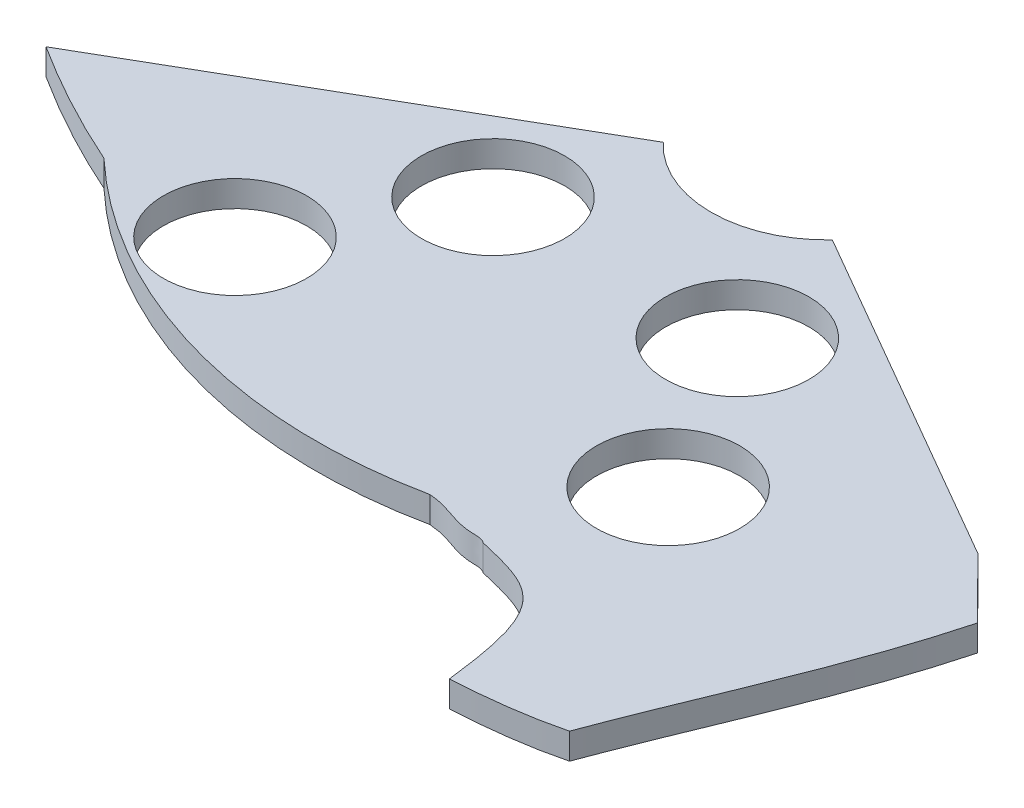
ISO-10303-21;
HEADER;
FILE_DESCRIPTION(('STEP AP214'),'2;1');
FILE_NAME('part.step','',(''),(''),'','','');
FILE_SCHEMA(('AUTOMOTIVE_DESIGN { 1 0 10303 214 1 1 1 1 }'));
ENDSEC;
DATA;
#1=APPLICATION_CONTEXT('core data for automotive mechanical design processes');
#2=APPLICATION_PROTOCOL_DEFINITION('international standard','automotive_design',2000,#1);
#3=PRODUCT_CONTEXT('',#1,'mechanical');
#4=PRODUCT('Part','Part','',(#3));
#5=PRODUCT_RELATED_PRODUCT_CATEGORY('part','',(#4));
#6=PRODUCT_DEFINITION_FORMATION('','',#4);
#7=PRODUCT_DEFINITION_CONTEXT('part definition',#1,'design');
#8=PRODUCT_DEFINITION('design','',#6,#7);
#9=PRODUCT_DEFINITION_SHAPE('','',#8);
#10=(LENGTH_UNIT() NAMED_UNIT(*) SI_UNIT(.MILLI.,.METRE.));
#11=(NAMED_UNIT(*) PLANE_ANGLE_UNIT() SI_UNIT($,.RADIAN.));
#12=(NAMED_UNIT(*) SI_UNIT($,.STERADIAN.) SOLID_ANGLE_UNIT());
#13=UNCERTAINTY_MEASURE_WITH_UNIT(LENGTH_MEASURE(1.E-05),#10,'distance_accuracy_value','');
#14=(GEOMETRIC_REPRESENTATION_CONTEXT(3) GLOBAL_UNCERTAINTY_ASSIGNED_CONTEXT((#13)) GLOBAL_UNIT_ASSIGNED_CONTEXT((#10,
#11,#12)) REPRESENTATION_CONTEXT('',''));
#15=CARTESIAN_POINT('',(0.,0.,0.));
#16=DIRECTION('',(0.,0.,1.));
#17=DIRECTION('',(1.,0.,0.));
#18=AXIS2_PLACEMENT_3D('',#15,#16,#17);
#19=CARTESIAN_POINT('',(50.4545002333364,-47.7359999999999,99.0797589701846));
#20=DIRECTION('',(0.,1.,0.));
#21=DIRECTION('',(0.,0.,1.));
#22=AXIS2_PLACEMENT_3D('',#19,#20,#21);
#23=PLANE('',#22);
#24=CARTESIAN_POINT('',(18.75,-47.7359999999999,32.476));
#25=DIRECTION('',(0.,-1.,0.));
#26=DIRECTION('',(0.,0.,-1.));
#27=AXIS2_PLACEMENT_3D('',#24,#25,#26);
#28=CIRCLE('',#27,10.999845998306);
#29=CARTESIAN_POINT('',(18.75,-47.7359999999999,21.476154001694));
#30=VERTEX_POINT('',#29);
#31=EDGE_CURVE('E476',#30,#30,#28,.T.);
#32=ORIENTED_EDGE('',*,*,#31,.F.);
#33=EDGE_LOOP('',(#32));
#34=FACE_BOUND('',#33,.T.);
#35=CARTESIAN_POINT('',(-33.25,-47.7359999999999,57.591));
#36=DIRECTION('',(0.,-1.,0.));
#37=DIRECTION('',(0.,0.,-1.));
#38=AXIS2_PLACEMENT_3D('',#35,#36,#37);
#39=CIRCLE('',#38,10.999845998306);
#40=CARTESIAN_POINT('',(-33.25,-47.7359999999999,46.591154001694));
#41=VERTEX_POINT('',#40);
#42=EDGE_CURVE('E438',#41,#41,#39,.T.);
#43=ORIENTED_EDGE('',*,*,#42,.F.);
#44=EDGE_LOOP('',(#43));
#45=FACE_BOUND('',#44,.T.);
#46=CARTESIAN_POINT('',(58.1236550059077,-47.7359999999999,97.60623936942));
#47=CARTESIAN_POINT('',(53.3063543837933,-47.7359999999999,98.8469564616505));
#48=CARTESIAN_POINT('',(47.877739729695,-47.7359999999999,99.532554783994));
#49=CARTESIAN_POINT('',(41.9600645203191,-47.7359999999999,99.8932986551236));
#50=B_SPLINE_CURVE_WITH_KNOTS('',3,(#46,#47,#48,#49),.UNSPECIFIED.,.F.,.F.,(4,4),(0.,1.),.UNSPECIFIED.);
#51=CARTESIAN_POINT('',(58.1236333761888,-47.7359999999999,97.6062449402475));
#52=VERTEX_POINT('',#51);
#53=CARTESIAN_POINT('',(41.9601443038788,-47.7359999999999,99.8932937914643));
#54=VERTEX_POINT('',#53);
#55=EDGE_CURVE('E426',#52,#54,#50,.T.);
#56=ORIENTED_EDGE('',*,*,#55,.T.);
#57=DIRECTION('',(-0.803323312901338,0.,-0.595543159602408));
#58=VECTOR('',#57,1.);
#59=CARTESIAN_POINT('',(41.9601443038788,-47.7359999999999,99.8932937914643));
#60=LINE('',#59,#58);
#61=CARTESIAN_POINT('',(41.9598808443938,-47.7359999999999,99.8930984759647));
#62=VERTEX_POINT('',#61);
#63=EDGE_CURVE('E110',#54,#62,#60,.T.);
#64=ORIENTED_EDGE('',*,*,#63,.T.);
#65=CARTESIAN_POINT('',(41.9599064263799,-47.7359999999999,99.8933082925096));
#66=CARTESIAN_POINT('',(41.9136796215511,-47.7359999999999,99.5141685179539));
#67=CARTESIAN_POINT('',(41.8240273725822,-47.7359999999999,98.7788649730003));
#68=CARTESIAN_POINT('',(41.6223415280567,-47.7359999999999,97.2357965297223));
#69=CARTESIAN_POINT('',(41.3520309105574,-47.7359999999999,95.3658266863958));
#70=CARTESIAN_POINT('',(40.9609838155468,-47.7359999999999,93.1025289505967));
#71=CARTESIAN_POINT('',(40.4898500439049,-47.7359999999999,90.9019339336516));
#72=CARTESIAN_POINT('',(39.8681523154453,-47.7359999999999,88.6856751252058));
#73=CARTESIAN_POINT('',(39.0324702122265,-47.7359999999999,86.5353918258231));
#74=CARTESIAN_POINT('',(38.0644771653085,-47.7359999999999,84.8623502560792));
#75=CARTESIAN_POINT('',(37.0826905965218,-47.7359999999999,83.6785386296944));
#76=CARTESIAN_POINT('',(36.2505037011043,-47.7359999999999,82.8912386045687));
#77=CARTESIAN_POINT('',(35.3237483813195,-47.7359999999999,82.206074176256));
#78=CARTESIAN_POINT('',(34.3369821246836,-47.7359999999999,81.6319970631862));
#79=CARTESIAN_POINT('',(33.280362004483,-47.7359999999999,81.1404465081158));
#80=CARTESIAN_POINT('',(31.8399712928665,-47.7359999999999,80.5917268042892));
#81=CARTESIAN_POINT('',(29.9756205744588,-47.7359999999999,80.0455244691998));
#82=CARTESIAN_POINT('',(27.7335886508905,-47.7359999999999,79.494400516862));
#83=CARTESIAN_POINT('',(25.9474640868269,-47.7359999999999,79.0719981797936));
#84=CARTESIAN_POINT('',(24.9143470138064,-47.7359999999999,78.8103290185063));
#85=CARTESIAN_POINT('',(24.627450886595,-47.7359999999999,78.7376636149964));
#86=B_SPLINE_CURVE_WITH_KNOTS('',3,(#65,#66,#67,#68,#69,#70,#71,#72,#73,#74,#75,#76,#77,#78,#79,
#80,#81,#82,#83,#84,#85),.UNSPECIFIED.,.F.,.F.,(4,1,1,1,1,1,1,1,1,1,1,1,1,1,1,1,1,1,4),(0.,
0.0372590655782159,0.0722602186315704,0.151806843381986,0.221553852219371,0.296283061667087,
0.37125515693742,0.445866892224854,0.520855543534189,0.558526767610036,0.595560823699377,
0.632325876297881,0.670709326434642,0.706723642247913,0.745895328604427,0.820965097437735,
0.896036966948439,0.97112951442333,1.),.UNSPECIFIED.);
#87=CARTESIAN_POINT('',(26.4526000611832,-47.7359999999999,79.1900571500032));
#88=VERTEX_POINT('',#87);
#89=EDGE_CURVE('E277',#62,#88,#86,.T.);
#90=ORIENTED_EDGE('',*,*,#89,.T.);
#91=CARTESIAN_POINT('',(15.9463461317283,-47.7359999999999,76.8631345149614));
#92=CARTESIAN_POINT('',(16.0349186676208,-47.7359999999999,76.8699952488525));
#93=CARTESIAN_POINT('',(16.2014291596154,-47.7359999999999,76.8828929734591));
#94=CARTESIAN_POINT('',(16.5552058601293,-47.7359999999999,76.9178891039632));
#95=CARTESIAN_POINT('',(17.1925741789564,-47.7359999999999,76.9996629331847));
#96=CARTESIAN_POINT('',(18.1171268339879,-47.7359999999999,77.180966088835));
#97=CARTESIAN_POINT('',(19.0228778908417,-47.7359999999999,77.4400890473989));
#98=CARTESIAN_POINT('',(19.7396059124913,-47.7359999999999,77.6763448393383));
#99=CARTESIAN_POINT('',(20.4548788063946,-47.7359999999999,77.9221711319904));
#100=CARTESIAN_POINT('',(21.3506455584367,-47.7359999999999,78.2260677505473));
#101=CARTESIAN_POINT('',(22.4467975100287,-47.7359999999999,78.5192203072604));
#102=CARTESIAN_POINT('',(23.3802844774172,-47.7359999999999,78.6689586021613));
#103=CARTESIAN_POINT('',(24.0218923582953,-47.7359999999999,78.7190307812592));
#104=CARTESIAN_POINT('',(24.9869181517329,-47.7359999999999,78.7594210102172));
#105=CARTESIAN_POINT('',(25.7662837705111,-47.7359999999999,78.6946604402071));
#106=CARTESIAN_POINT('',(26.4526000611883,-47.7359999999999,79.1900571500034));
#107=B_SPLINE_CURVE_WITH_KNOTS('',3,(#91,#92,#93,#94,#95,#96,#97,#98,#99,#100,#101,#102,#103,
#104,#105,#106),.UNSPECIFIED.,.F.,.F.,(4,1,1,1,1,1,1,1,1,1,1,1,1,4),(-0.511072759064358,
-0.481190059937095,-0.454895266982101,-0.391495215083181,-0.265087959623093,-0.138428007429866,
-0.074862953904877,-0.0112348579292886,0.115994009552745,0.243269880945794,0.369974881399668,
0.433338957204713,0.459665995638456,0.694844596012279),.UNSPECIFIED.);
#108=CARTESIAN_POINT('',(15.9463461317283,-47.7359999999999,76.8631345149614));
#109=VERTEX_POINT('',#108);
#110=EDGE_CURVE('E260',#88,#109,#107,.F.);
#111=ORIENTED_EDGE('',*,*,#110,.T.);
#112=CARTESIAN_POINT('',(-53.7925190008307,-47.7359999999999,57.1715620321963));
#113=CARTESIAN_POINT('',(-51.5067879276189,-47.7359999999999,59.3225126550984));
#114=CARTESIAN_POINT('',(-49.0927337036031,-47.7359999999999,61.335512341454));
#115=CARTESIAN_POINT('',(-44.0392056625974,-47.7359999999999,65.0587222228256));
#116=CARTESIAN_POINT('',(-41.4004114246385,-47.7359999999999,66.7691294634532));
#117=CARTESIAN_POINT('',(-33.2074671785609,-47.7359999999999,71.4072570539393));
#118=CARTESIAN_POINT('',(-27.3728712629462,-47.7359999999999,73.8409296722342));
#119=CARTESIAN_POINT('',(-18.3117111209384,-47.7359999999999,76.3985288720214));
#120=CARTESIAN_POINT('',(-15.2395918122596,-47.7359999999999,77.0700449589798));
#121=CARTESIAN_POINT('',(-9.03835232532188,-47.7359999999999,78.0407980399762));
#122=CARTESIAN_POINT('',(-5.90888980689045,-47.7359999999999,78.3395161847587));
#123=CARTESIAN_POINT('',(0.364731385860129,-47.7359999999999,78.5611583825753));
#124=CARTESIAN_POINT('',(3.50826904111767,-47.7359999999999,78.4842083991054));
#125=CARTESIAN_POINT('',(9.76128948684666,-47.7359999999999,77.9539257140327));
#126=CARTESIAN_POINT('',(12.8733144267638,-47.7359999999999,77.500414419352));
#127=CARTESIAN_POINT('',(15.94634613171,-47.7359999999999,76.8631345148816));
#128=B_SPLINE_CURVE_WITH_KNOTS('',3,(#112,#113,#114,#115,#116,#117,#118,#119,#120,#121,#122,
#123,#124,#125,#126,#127),.UNSPECIFIED.,.F.,.F.,(4,2,2,2,2,2,2,4),(1.8714680629639E-06,
0.125001871468063,0.250001871468063,0.500001871468063,0.625001871468063,0.750001871468063,
0.875001871468063,1.),.UNSPECIFIED.);
#129=CARTESIAN_POINT('',(-53.7925190008307,-47.7359999999999,57.1715620321963));
#130=VERTEX_POINT('',#129);
#131=EDGE_CURVE('E461',#109,#130,#128,.F.);
#132=ORIENTED_EDGE('',*,*,#131,.T.);
#133=CARTESIAN_POINT('',(-73.0589578356867,-47.7359999999999,46.7994745524431));
#134=CARTESIAN_POINT('',(-72.605285648142,-47.7359999999999,47.0869715717123));
#135=CARTESIAN_POINT('',(-71.6919777443133,-47.7359999999999,47.6657447635335));
#136=CARTESIAN_POINT('',(-70.1024919814528,-47.7359999999999,48.6430162496284));
#137=CARTESIAN_POINT('',(-68.2739140317229,-47.7359999999999,49.735875425829));
#138=CARTESIAN_POINT('',(-66.2266480228188,-47.7359999999999,50.9145990127126));
#139=CARTESIAN_POINT('',(-64.1364579733773,-47.7359999999999,52.0742657152988));
#140=CARTESIAN_POINT('',(-62.0609857516435,-47.7359999999999,53.1820058272664));
#141=CARTESIAN_POINT('',(-59.9245981104603,-47.7359999999999,54.2778266083573));
#142=CARTESIAN_POINT('',(-58.2167192811015,-47.7359999999999,55.1183422239238));
#143=CARTESIAN_POINT('',(-56.8747572673933,-47.7359999999999,55.7592839251759));
#144=CARTESIAN_POINT('',(-55.9306994311954,-47.7359999999999,56.2019198641064));
#145=CARTESIAN_POINT('',(-54.8942332656221,-47.7359999999999,56.6789234612153));
#146=CARTESIAN_POINT('',(-54.169845740253,-47.7359999999999,57.0028367932866));
#147=CARTESIAN_POINT('',(-53.7925226257047,-47.7359999999999,57.171558621066));
#148=B_SPLINE_CURVE_WITH_KNOTS('',3,(#133,#134,#135,#136,#137,#138,#139,#140,#141,#142,#143,
#144,#145,#146,#147),.UNSPECIFIED.,.F.,.F.,(4,1,1,1,1,1,1,1,1,1,1,1,4),(0.,0.0735699952039779,
0.148107069265318,0.255578974128456,0.365359669575418,0.471683017424209,0.58299103191735,
0.68759811495675,0.80056029840056,0.843715385452293,0.891306996020602,0.943383366837763,1.),.UNSPECIFIED.);
#149=CARTESIAN_POINT('',(-73.0589578356867,-47.7359999999999,46.7994745524431));
#150=VERTEX_POINT('',#149);
#151=EDGE_CURVE('E326',#130,#150,#148,.F.);
#152=ORIENTED_EDGE('',*,*,#151,.T.);
#153=CARTESIAN_POINT('',(-73.0589561353499,-47.7359999999999,46.7994735707082));
#154=DIRECTION('',(0.866024430196259,0.,-0.500001686300401));
#155=VECTOR('',#154,1.);
#156=LINE('',#153,#155);
#157=CARTESIAN_POINT('',(-69.4473396581905,-47.7359999999999,44.7142964488102));
#158=VERTEX_POINT('',#157);
#159=EDGE_CURVE('E322',#150,#158,#156,.T.);
#160=ORIENTED_EDGE('',*,*,#159,.T.);
#161=DIRECTION('',(0.866025121866504,0.,-0.500000488295869));
#162=VECTOR('',#161,1.);
#163=CARTESIAN_POINT('',(-69.4473396581905,-47.7359999999999,44.7142964488102));
#164=LINE('',#163,#162);
#165=CARTESIAN_POINT('',(-12.9766531358799,-47.7359999999999,12.1108879302399));
#166=VERTEX_POINT('',#165);
#167=EDGE_CURVE('E319',#158,#166,#164,.T.);
#168=ORIENTED_EDGE('',*,*,#167,.T.);
#169=CARTESIAN_POINT('',(0.,-47.7359999999999,0.));
#170=DIRECTION('',(0.,1.,0.));
#171=DIRECTION('',(0.,0.,-1.));
#172=AXIS2_PLACEMENT_3D('',#169,#170,#171);
#173=CIRCLE('',#172,17.7501305084715);
#174=CARTESIAN_POINT('',(12.9766531358511,-47.7359999999999,12.1108879302707));
#175=VERTEX_POINT('',#174);
#176=EDGE_CURVE('E315',#166,#175,#173,.T.);
#177=ORIENTED_EDGE('',*,*,#176,.T.);
#178=DIRECTION('',(0.866025113442762,0.,0.500000502886198));
#179=VECTOR('',#178,1.);
#180=CARTESIAN_POINT('',(12.9766531358511,-47.7359999999999,12.1108879302707));
#181=LINE('',#180,#179);
#182=CARTESIAN_POINT('',(65.8946490574716,-47.7359999999999,42.6631480920527));
#183=VERTEX_POINT('',#182);
#184=EDGE_CURVE('E144',#175,#183,#181,.T.);
#185=ORIENTED_EDGE('',*,*,#184,.T.);
#186=DIRECTION('',(0.702943256867949,0.,0.711245933291629));
#187=VECTOR('',#186,1.);
#188=CARTESIAN_POINT('',(65.8946490574716,-47.7359999999999,42.6631480920527));
#189=LINE('',#188,#187);
#190=CARTESIAN_POINT('',(75.0480430404488,-47.7359999999999,51.9246555929797));
#191=VERTEX_POINT('',#190);
#192=EDGE_CURVE('E138',#183,#191,#189,.T.);
#193=ORIENTED_EDGE('',*,*,#192,.T.);
#194=CARTESIAN_POINT('',(75.0480430404488,-47.7359999999999,51.9246555929797));
#195=CARTESIAN_POINT('',(74.9426312519638,-47.7359999999999,52.3150510355307));
#196=CARTESIAN_POINT('',(74.7316675790062,-47.7359999999999,53.096360769956));
#197=CARTESIAN_POINT('',(74.4023164554292,-47.7359999999999,54.2656148602608));
#198=CARTESIAN_POINT('',(73.7528852987223,-47.7359999999999,56.5056003987164));
#199=CARTESIAN_POINT('',(72.7230883615606,-47.7359999999999,59.8194279116378));
#200=CARTESIAN_POINT('',(71.2466063040113,-47.7359999999999,64.1657434690851));
#201=CARTESIAN_POINT('',(69.665233264831,-47.7359999999999,68.5062375426102));
#202=CARTESIAN_POINT('',(68.0152113185609,-47.7359999999999,72.8000992632395));
#203=CARTESIAN_POINT('',(66.3007154541003,-47.7359999999999,77.1009862484116));
#204=CARTESIAN_POINT('',(64.5671637799669,-47.7359999999999,81.356661930585));
#205=CARTESIAN_POINT('',(62.8109563586594,-47.7359999999999,85.6455369293485));
#206=CARTESIAN_POINT('',(61.3188622553605,-47.7359999999999,89.3244001847595));
#207=CARTESIAN_POINT('',(60.0801622406337,-47.7359999999999,92.4534486491044));
#208=CARTESIAN_POINT('',(59.0914281788532,-47.7359999999999,95.0039335378016));
#209=CARTESIAN_POINT('',(58.4486093786368,-47.7359999999999,96.732476575468));
#210=CARTESIAN_POINT('',(58.1236719399684,-47.7359999999999,97.6062350080125));
#211=B_SPLINE_CURVE_WITH_KNOTS('',3,(#194,#195,#196,#197,#198,#199,#200,#201,#202,#203,#204,
#205,#206,#207,#208,#209,#210),.UNSPECIFIED.,.F.,.F.,(4,1,1,1,1,1,1,1,1,1,1,1,1,1,4),(0.,
0.0248867092257348,0.0498064937664743,0.0747591518455765,0.168420307806276,0.2633396901094,
0.357235214354444,0.452709075520436,0.546429349108186,0.642180112609381,0.73551488478608,
0.831655618293486,0.886502104148551,0.942628131660436,1.),.UNSPECIFIED.);
#212=CARTESIAN_POINT('',(58.1237066892796,-47.7359999999999,97.6061415669372));
#213=VERTEX_POINT('',#212);
#214=EDGE_CURVE('E142',#191,#213,#211,.T.);
#215=ORIENTED_EDGE('',*,*,#214,.T.);
#216=DIRECTION('',(-0.578491868173202,0.,0.815688150249517));
#217=VECTOR('',#216,1.);
#218=CARTESIAN_POINT('',(58.1236333761888,-47.7359999999999,97.6062449402475));
#219=LINE('',#218,#217);
#220=EDGE_CURVE('E52',#213,#52,#219,.T.);
#221=ORIENTED_EDGE('',*,*,#220,.T.);
#222=EDGE_LOOP('',(#56,#64,#90,#111,#132,#152,#160,#168,#177,#185,#193,#215,#221));
#223=FACE_BOUND('',#222,.T.);
#224=CARTESIAN_POINT('',(33.25,-47.7359999999999,57.591));
#225=DIRECTION('',(0.,-1.,0.));
#226=DIRECTION('',(0.,0.,-1.));
#227=AXIS2_PLACEMENT_3D('',#224,#225,#226);
#228=CIRCLE('',#227,10.999845998306);
#229=CARTESIAN_POINT('',(33.25,-47.7359999999999,46.591154001694));
#230=VERTEX_POINT('',#229);
#231=EDGE_CURVE('E450',#230,#230,#228,.T.);
#232=ORIENTED_EDGE('',*,*,#231,.F.);
#233=EDGE_LOOP('',(#232));
#234=FACE_BOUND('',#233,.T.);
#235=CARTESIAN_POINT('',(-18.75,-47.7359999999999,32.476));
#236=DIRECTION('',(0.,-1.,0.));
#237=DIRECTION('',(0.,0.,-1.));
#238=AXIS2_PLACEMENT_3D('',#235,#236,#237);
#239=CIRCLE('',#238,10.999845998306);
#240=CARTESIAN_POINT('',(-18.75,-47.7359999999999,21.476154001694));
#241=VERTEX_POINT('',#240);
#242=EDGE_CURVE('E482',#241,#241,#239,.T.);
#243=ORIENTED_EDGE('',*,*,#242,.F.);
#244=EDGE_LOOP('',(#243));
#245=FACE_BOUND('',#244,.T.);
#246=ADVANCED_FACE('F30',(#34,#45,#223,#234,#245),#23,.F.);
#247=CARTESIAN_POINT('',(50.4545002333364,-43.7359999999999,99.0797589701846));
#248=DIRECTION('',(0.,1.,0.));
#249=DIRECTION('',(0.,0.,1.));
#250=AXIS2_PLACEMENT_3D('',#247,#248,#249);
#251=PLANE('',#250);
#252=CARTESIAN_POINT('',(18.75,-43.7359999999999,32.476));
#253=DIRECTION('',(0.,-1.,0.));
#254=DIRECTION('',(0.,0.,-1.));
#255=AXIS2_PLACEMENT_3D('',#252,#253,#254);
#256=CIRCLE('',#255,10.999845998306);
#257=CARTESIAN_POINT('',(18.75,-43.7359999999999,21.476154001694));
#258=VERTEX_POINT('',#257);
#259=EDGE_CURVE('E478',#258,#258,#256,.T.);
#260=ORIENTED_EDGE('',*,*,#259,.T.);
#261=EDGE_LOOP('',(#260));
#262=FACE_BOUND('',#261,.T.);
#263=CARTESIAN_POINT('',(-33.25,-43.7359999999999,57.591));
#264=DIRECTION('',(0.,-1.,0.));
#265=DIRECTION('',(0.,0.,-1.));
#266=AXIS2_PLACEMENT_3D('',#263,#264,#265);
#267=CIRCLE('',#266,10.999845998306);
#268=CARTESIAN_POINT('',(-33.25,-43.7359999999999,46.591154001694));
#269=VERTEX_POINT('',#268);
#270=EDGE_CURVE('E445',#269,#269,#267,.T.);
#271=ORIENTED_EDGE('',*,*,#270,.T.);
#272=EDGE_LOOP('',(#271));
#273=FACE_BOUND('',#272,.T.);
#274=CARTESIAN_POINT('',(58.1236550059077,-43.7359999999999,97.60623936942));
#275=CARTESIAN_POINT('',(53.3063543837933,-43.7359999999999,98.8469564616505));
#276=CARTESIAN_POINT('',(47.877739729695,-43.7359999999999,99.532554783994));
#277=CARTESIAN_POINT('',(41.9600645203191,-43.7359999999999,99.8932986551236));
#278=B_SPLINE_CURVE_WITH_KNOTS('',3,(#274,#275,#276,#277),.UNSPECIFIED.,.F.,.F.,(4,4),(0.,1.),.UNSPECIFIED.);
#279=CARTESIAN_POINT('',(58.1236333761888,-43.7359999999999,97.6062449402475));
#280=VERTEX_POINT('',#279);
#281=CARTESIAN_POINT('',(41.9601443038788,-43.7359999999999,99.8932937914643));
#282=VERTEX_POINT('',#281);
#283=EDGE_CURVE('E380',#280,#282,#278,.T.);
#284=ORIENTED_EDGE('',*,*,#283,.F.);
#285=DIRECTION('',(-0.578491868173202,0.,0.815688150249517));
#286=VECTOR('',#285,1.);
#287=CARTESIAN_POINT('',(58.1236333761888,-43.7359999999999,97.6062449402475));
#288=LINE('',#287,#286);
#289=CARTESIAN_POINT('',(58.1237066892796,-43.7359999999999,97.6061415669372));
#290=VERTEX_POINT('',#289);
#291=EDGE_CURVE('E102',#290,#280,#288,.T.);
#292=ORIENTED_EDGE('',*,*,#291,.F.);
#293=CARTESIAN_POINT('',(75.0480430404488,-43.7359999999999,51.9246555929797));
#294=CARTESIAN_POINT('',(74.9426312519638,-43.7359999999999,52.3150510355307));
#295=CARTESIAN_POINT('',(74.7316675790062,-43.7359999999999,53.096360769956));
#296=CARTESIAN_POINT('',(74.4023164554292,-43.7359999999999,54.2656148602608));
#297=CARTESIAN_POINT('',(73.7528852987223,-43.7359999999999,56.5056003987164));
#298=CARTESIAN_POINT('',(72.7230883615606,-43.7359999999999,59.8194279116378));
#299=CARTESIAN_POINT('',(71.2466063040113,-43.7359999999999,64.1657434690851));
#300=CARTESIAN_POINT('',(69.665233264831,-43.7359999999999,68.5062375426102));
#301=CARTESIAN_POINT('',(68.0152113185609,-43.7359999999999,72.8000992632395));
#302=CARTESIAN_POINT('',(66.3007154541003,-43.7359999999999,77.1009862484116));
#303=CARTESIAN_POINT('',(64.5671637799669,-43.7359999999999,81.356661930585));
#304=CARTESIAN_POINT('',(62.8109563586594,-43.7359999999999,85.6455369293485));
#305=CARTESIAN_POINT('',(61.3188622553605,-43.7359999999999,89.3244001847595));
#306=CARTESIAN_POINT('',(60.0801622406337,-43.7359999999999,92.4534486491044));
#307=CARTESIAN_POINT('',(59.0914281788532,-43.7359999999999,95.0039335378016));
#308=CARTESIAN_POINT('',(58.4486093786368,-43.7359999999999,96.732476575468));
#309=CARTESIAN_POINT('',(58.1236719399684,-43.7359999999999,97.6062350080125));
#310=B_SPLINE_CURVE_WITH_KNOTS('',3,(#293,#294,#295,#296,#297,#298,#299,#300,#301,#302,#303,
#304,#305,#306,#307,#308,#309),.UNSPECIFIED.,.F.,.F.,(4,1,1,1,1,1,1,1,1,1,1,1,1,1,4),(0.,
0.0248867092257348,0.0498064937664743,0.0747591518455765,0.168420307806276,0.2633396901094,
0.357235214354444,0.452709075520436,0.546429349108186,0.642180112609381,0.73551488478608,
0.831655618293486,0.886502104148551,0.942628131660436,1.),.UNSPECIFIED.);
#311=CARTESIAN_POINT('',(75.0480430404488,-43.7359999999999,51.9246555929797));
#312=VERTEX_POINT('',#311);
#313=EDGE_CURVE('E96',#312,#290,#310,.T.);
#314=ORIENTED_EDGE('',*,*,#313,.F.);
#315=DIRECTION('',(0.702943256867949,0.,0.711245933291629));
#316=VECTOR('',#315,1.);
#317=CARTESIAN_POINT('',(65.8946490574716,-43.7359999999999,42.6631480920527));
#318=LINE('',#317,#316);
#319=CARTESIAN_POINT('',(65.8946490574716,-43.7359999999999,42.6631480920527));
#320=VERTEX_POINT('',#319);
#321=EDGE_CURVE('E152',#320,#312,#318,.T.);
#322=ORIENTED_EDGE('',*,*,#321,.F.);
#323=DIRECTION('',(0.866025113442762,0.,0.500000502886198));
#324=VECTOR('',#323,1.);
#325=CARTESIAN_POINT('',(12.9766531358511,-43.7359999999999,12.1108879302707));
#326=LINE('',#325,#324);
#327=CARTESIAN_POINT('',(12.9766531358511,-43.7359999999999,12.1108879302707));
#328=VERTEX_POINT('',#327);
#329=EDGE_CURVE('E420',#328,#320,#326,.T.);
#330=ORIENTED_EDGE('',*,*,#329,.F.);
#331=CARTESIAN_POINT('',(0.,-43.7359999999999,0.));
#332=DIRECTION('',(0.,1.,0.));
#333=DIRECTION('',(0.,0.,-1.));
#334=AXIS2_PLACEMENT_3D('',#331,#332,#333);
#335=CIRCLE('',#334,17.7501305084715);
#336=CARTESIAN_POINT('',(-12.9766531358799,-43.7359999999999,12.1108879302399));
#337=VERTEX_POINT('',#336);
#338=EDGE_CURVE('E418',#337,#328,#335,.T.);
#339=ORIENTED_EDGE('',*,*,#338,.F.);
#340=DIRECTION('',(0.866025121866504,0.,-0.500000488295869));
#341=VECTOR('',#340,1.);
#342=CARTESIAN_POINT('',(-69.4473396581905,-43.7359999999999,44.7142964488102));
#343=LINE('',#342,#341);
#344=CARTESIAN_POINT('',(-69.4473396581905,-43.7359999999999,44.7142964488102));
#345=VERTEX_POINT('',#344);
#346=EDGE_CURVE('E223',#345,#337,#343,.T.);
#347=ORIENTED_EDGE('',*,*,#346,.F.);
#348=CARTESIAN_POINT('',(-73.0589561353327,-43.7359999999999,46.7994735707379));
#349=DIRECTION('',(0.866024220031395,0.,-0.50000205031481));
#350=VECTOR('',#349,1.);
#351=LINE('',#348,#350);
#352=CARTESIAN_POINT('',(-73.0589578356867,-43.7359999999999,46.7994745524431));
#353=VERTEX_POINT('',#352);
#354=EDGE_CURVE('E219',#353,#345,#351,.T.);
#355=ORIENTED_EDGE('',*,*,#354,.F.);
#356=CARTESIAN_POINT('',(-53.7925226257047,-43.7359999999999,57.171558621066));
#357=CARTESIAN_POINT('',(-54.169845740253,-43.7359999999999,57.0028367932866));
#358=CARTESIAN_POINT('',(-54.8942332656221,-43.7359999999999,56.6789234612153));
#359=CARTESIAN_POINT('',(-55.9306994311954,-43.7359999999999,56.2019198641064));
#360=CARTESIAN_POINT('',(-56.8747572673933,-43.7359999999999,55.7592839251759));
#361=CARTESIAN_POINT('',(-58.2167192811015,-43.7359999999999,55.1183422239238));
#362=CARTESIAN_POINT('',(-59.9245981104603,-43.7359999999999,54.2778266083573));
#363=CARTESIAN_POINT('',(-62.0609857516435,-43.7359999999999,53.1820058272664));
#364=CARTESIAN_POINT('',(-64.1364579733773,-43.7359999999999,52.0742657152988));
#365=CARTESIAN_POINT('',(-66.2266480228188,-43.7359999999999,50.9145990127126));
#366=CARTESIAN_POINT('',(-68.2739140317229,-43.7359999999999,49.735875425829));
#367=CARTESIAN_POINT('',(-70.1024919814528,-43.7359999999999,48.6430162496284));
#368=CARTESIAN_POINT('',(-71.6919777443133,-43.7359999999999,47.6657447635335));
#369=CARTESIAN_POINT('',(-72.605285648142,-43.7359999999999,47.0869715717123));
#370=CARTESIAN_POINT('',(-73.0589578356867,-43.7359999999999,46.7994745524431));
#371=B_SPLINE_CURVE_WITH_KNOTS('',3,(#356,#357,#358,#359,#360,#361,#362,#363,#364,#365,#366,
#367,#368,#369,#370),.UNSPECIFIED.,.F.,.F.,(4,1,1,1,1,1,1,1,1,1,1,1,4),(0.,0.0566166331622369,
0.108693003979398,0.156284614547707,0.19943970159944,0.312401885043249,0.41700896808265,
0.528316982575791,0.634640330424582,0.744421025871544,0.851892930734682,0.926430004796022,1.),.UNSPECIFIED.);
#372=CARTESIAN_POINT('',(-53.7925190008307,-43.7359999999999,57.1715620321963));
#373=VERTEX_POINT('',#372);
#374=EDGE_CURVE('E358',#373,#353,#371,.T.);
#375=ORIENTED_EDGE('',*,*,#374,.F.);
#376=CARTESIAN_POINT('',(15.94634613171,-43.7359999999999,76.8631345148816));
#377=CARTESIAN_POINT('',(12.8733144267638,-43.7359999999999,77.500414419352));
#378=CARTESIAN_POINT('',(9.76128948684666,-43.7359999999999,77.9539257140327));
#379=CARTESIAN_POINT('',(3.50826904111767,-43.7359999999999,78.4842083991054));
#380=CARTESIAN_POINT('',(0.364731385860129,-43.7359999999999,78.5611583825753));
#381=CARTESIAN_POINT('',(-5.90888980689045,-43.7359999999999,78.3395161847587));
#382=CARTESIAN_POINT('',(-9.03835232532188,-43.7359999999999,78.0407980399762));
#383=CARTESIAN_POINT('',(-15.2395918122596,-43.7359999999999,77.0700449589798));
#384=CARTESIAN_POINT('',(-18.3117111209384,-43.7359999999999,76.3985288720214));
#385=CARTESIAN_POINT('',(-27.3728712629462,-43.7359999999999,73.8409296722342));
#386=CARTESIAN_POINT('',(-33.2074671785609,-43.7359999999999,71.4072570539393));
#387=CARTESIAN_POINT('',(-41.4004114246385,-43.7359999999999,66.7691294634532));
#388=CARTESIAN_POINT('',(-44.0392056625974,-43.7359999999999,65.0587222228256));
#389=CARTESIAN_POINT('',(-49.0927337036031,-43.7359999999999,61.335512341454));
#390=CARTESIAN_POINT('',(-51.5067879276189,-43.7359999999999,59.3225126550984));
#391=CARTESIAN_POINT('',(-53.7925190008307,-43.7359999999999,57.1715620321963));
#392=B_SPLINE_CURVE_WITH_KNOTS('',3,(#376,#377,#378,#379,#380,#381,#382,#383,#384,#385,#386,
#387,#388,#389,#390,#391),.UNSPECIFIED.,.F.,.F.,(4,2,2,2,2,2,2,4),(1.87146806285872E-06,0.125,
0.25,0.375,0.5,0.75,0.875,1.),.UNSPECIFIED.);
#393=CARTESIAN_POINT('',(15.9463461317283,-43.7359999999999,76.8631345149614));
#394=VERTEX_POINT('',#393);
#395=EDGE_CURVE('E369',#394,#373,#392,.T.);
#396=ORIENTED_EDGE('',*,*,#395,.F.);
#397=CARTESIAN_POINT('',(26.4526000611883,-43.7359999999999,79.1900571500034));
#398=CARTESIAN_POINT('',(25.7662837705111,-43.7359999999999,78.6946604402071));
#399=CARTESIAN_POINT('',(24.9869181517329,-43.7359999999999,78.7594210102172));
#400=CARTESIAN_POINT('',(24.0218923582953,-43.7359999999999,78.7190307812592));
#401=CARTESIAN_POINT('',(23.3802844774172,-43.7359999999999,78.6689586021613));
#402=CARTESIAN_POINT('',(22.4467975100287,-43.7359999999999,78.5192203072604));
#403=CARTESIAN_POINT('',(21.3506455584367,-43.7359999999999,78.2260677505473));
#404=CARTESIAN_POINT('',(20.4548788063946,-43.7359999999999,77.9221711319904));
#405=CARTESIAN_POINT('',(19.7396059124913,-43.7359999999999,77.6763448393383));
#406=CARTESIAN_POINT('',(19.0228778908417,-43.7359999999999,77.4400890473989));
#407=CARTESIAN_POINT('',(18.1171268339879,-43.7359999999999,77.180966088835));
#408=CARTESIAN_POINT('',(17.1925741789564,-43.7359999999999,76.9996629331847));
#409=CARTESIAN_POINT('',(16.5552058601293,-43.7359999999999,76.9178891039632));
#410=CARTESIAN_POINT('',(16.2014291596154,-43.7359999999999,76.8828929734591));
#411=CARTESIAN_POINT('',(16.0349186676208,-43.7359999999999,76.8699952488525));
#412=CARTESIAN_POINT('',(15.9463461317283,-43.7359999999999,76.8631345149614));
#413=B_SPLINE_CURVE_WITH_KNOTS('',3,(#397,#398,#399,#400,#401,#402,#403,#404,#405,#406,#407,
#408,#409,#410,#411,#412),.UNSPECIFIED.,.F.,.F.,(4,1,1,1,1,1,1,1,1,1,1,1,1,4),
(-0.511072759064358,-0.275894158690534,-0.249567120256791,-0.186203044451746,
-0.0594980439978727,0.067777827395177,0.19500669487721,0.258634790852799,0.322199844377788,
0.448859796571015,0.575267052031103,0.638667103930022,0.664961896885016,0.694844596012279),.UNSPECIFIED.);
#414=CARTESIAN_POINT('',(26.4526000611832,-43.7359999999999,79.1900571500032));
#415=VERTEX_POINT('',#414);
#416=EDGE_CURVE('E370',#415,#394,#413,.T.);
#417=ORIENTED_EDGE('',*,*,#416,.F.);
#418=CARTESIAN_POINT('',(41.9599064263799,-43.7359999999999,99.8933082925096));
#419=CARTESIAN_POINT('',(41.9136796215511,-43.7359999999999,99.5141685179539));
#420=CARTESIAN_POINT('',(41.8240273725822,-43.7359999999999,98.7788649730003));
#421=CARTESIAN_POINT('',(41.6223415280567,-43.7359999999999,97.2357965297223));
#422=CARTESIAN_POINT('',(41.3520309105574,-43.7359999999999,95.3658266863958));
#423=CARTESIAN_POINT('',(40.9609838155468,-43.7359999999999,93.1025289505967));
#424=CARTESIAN_POINT('',(40.4898500439049,-43.7359999999999,90.9019339336516));
#425=CARTESIAN_POINT('',(39.8681523154453,-43.7359999999999,88.6856751252058));
#426=CARTESIAN_POINT('',(39.0324702122265,-43.7359999999999,86.5353918258231));
#427=CARTESIAN_POINT('',(38.0644771653085,-43.7359999999999,84.8623502560792));
#428=CARTESIAN_POINT('',(37.0826905965218,-43.7359999999999,83.6785386296944));
#429=CARTESIAN_POINT('',(36.2505037011043,-43.7359999999999,82.8912386045687));
#430=CARTESIAN_POINT('',(35.3237483813195,-43.7359999999999,82.206074176256));
#431=CARTESIAN_POINT('',(34.3369821246836,-43.7359999999999,81.6319970631862));
#432=CARTESIAN_POINT('',(33.280362004483,-43.7359999999999,81.1404465081158));
#433=CARTESIAN_POINT('',(31.8399712928665,-43.7359999999999,80.5917268042892));
#434=CARTESIAN_POINT('',(29.9756205744588,-43.7359999999999,80.0455244691998));
#435=CARTESIAN_POINT('',(27.7335886508905,-43.7359999999999,79.494400516862));
#436=CARTESIAN_POINT('',(25.9474640868269,-43.7359999999999,79.0719981797936));
#437=CARTESIAN_POINT('',(24.9143470138064,-43.7359999999999,78.8103290185063));
#438=CARTESIAN_POINT('',(24.627450886595,-43.7359999999999,78.7376636149964));
#439=B_SPLINE_CURVE_WITH_KNOTS('',3,(#418,#419,#420,#421,#422,#423,#424,#425,#426,#427,#428,
#429,#430,#431,#432,#433,#434,#435,#436,#437,#438),.UNSPECIFIED.,.F.,.F.,(4,1,1,1,1,1,1,1,1,1,1,
1,1,1,1,1,1,1,4),(0.,0.0372590655782159,0.0722602186315704,0.151806843381986,0.221553852219371,
0.296283061667087,0.37125515693742,0.445866892224854,0.520855543534189,0.558526767610036,
0.595560823699377,0.632325876297881,0.670709326434642,0.706723642247913,0.745895328604427,
0.820965097437735,0.896036966948439,0.97112951442333,1.),.UNSPECIFIED.);
#440=CARTESIAN_POINT('',(41.9598808443938,-43.7359999999999,99.8930984759647));
#441=VERTEX_POINT('',#440);
#442=EDGE_CURVE('E373',#441,#415,#439,.T.);
#443=ORIENTED_EDGE('',*,*,#442,.F.);
#444=DIRECTION('',(-0.803323312901338,0.,-0.595543159602408));
#445=VECTOR('',#444,1.);
#446=CARTESIAN_POINT('',(41.9601443038788,-43.7359999999999,99.8932937914643));
#447=LINE('',#446,#445);
#448=EDGE_CURVE('E375',#282,#441,#447,.T.);
#449=ORIENTED_EDGE('',*,*,#448,.F.);
#450=EDGE_LOOP('',(#284,#292,#314,#322,#330,#339,#347,#355,#375,#396,#417,#443,#449));
#451=FACE_BOUND('',#450,.T.);
#452=CARTESIAN_POINT('',(33.25,-43.7359999999999,57.591));
#453=DIRECTION('',(0.,-1.,0.));
#454=DIRECTION('',(0.,0.,-1.));
#455=AXIS2_PLACEMENT_3D('',#452,#453,#454);
#456=CIRCLE('',#455,10.999845998306);
#457=CARTESIAN_POINT('',(33.25,-43.7359999999999,46.591154001694));
#458=VERTEX_POINT('',#457);
#459=EDGE_CURVE('E453',#458,#458,#456,.T.);
#460=ORIENTED_EDGE('',*,*,#459,.T.);
#461=EDGE_LOOP('',(#460));
#462=FACE_BOUND('',#461,.T.);
#463=CARTESIAN_POINT('',(-18.75,-43.7359999999999,32.476));
#464=DIRECTION('',(0.,-1.,0.));
#465=DIRECTION('',(0.,0.,-1.));
#466=AXIS2_PLACEMENT_3D('',#463,#464,#465);
#467=CIRCLE('',#466,10.999845998306);
#468=CARTESIAN_POINT('',(-18.75,-43.7359999999999,21.476154001694));
#469=VERTEX_POINT('',#468);
#470=EDGE_CURVE('E485',#469,#469,#467,.T.);
#471=ORIENTED_EDGE('',*,*,#470,.T.);
#472=EDGE_LOOP('',(#471));
#473=FACE_BOUND('',#472,.T.);
#474=ADVANCED_FACE('F225',(#262,#273,#451,#462,#473),#251,.T.);
#475=DIRECTION('',(0.,1.,0.));
#476=VECTOR('',#475,1.);
#477=SURFACE_OF_LINEAR_EXTRUSION('',#50,#476);
#478=ORIENTED_EDGE('',*,*,#283,.T.);
#479=DIRECTION('',(0.,1.,0.));
#480=VECTOR('',#479,1.);
#481=CARTESIAN_POINT('',(41.9601443038788,-47.7359999999999,99.8932937914643));
#482=LINE('',#481,#480);
#483=EDGE_CURVE('E11',#54,#282,#482,.T.);
#484=ORIENTED_EDGE('',*,*,#483,.F.);
#485=ORIENTED_EDGE('',*,*,#55,.F.);
#486=DIRECTION('',(0.,1.,0.));
#487=VECTOR('',#486,1.);
#488=CARTESIAN_POINT('',(58.1236333761888,-47.7359999999999,97.6062449402475));
#489=LINE('',#488,#487);
#490=EDGE_CURVE('E158',#52,#280,#489,.T.);
#491=ORIENTED_EDGE('',*,*,#490,.T.);
#492=EDGE_LOOP('',(#478,#484,#485,#491));
#493=FACE_BOUND('',#492,.T.);
#494=ADVANCED_FACE('F32',(#493),#477,.F.);
#495=CARTESIAN_POINT('',(41.9601443038788,-47.7359999999999,99.8932937914643));
#496=DIRECTION('',(0.595543159602408,0.,-0.803323312901338));
#497=DIRECTION('',(-0.803323312901338,0.,-0.595543159602408));
#498=AXIS2_PLACEMENT_3D('',#495,#496,#497);
#499=PLANE('',#498);
#500=ORIENTED_EDGE('',*,*,#448,.T.);
#501=DIRECTION('',(0.,1.,0.));
#502=VECTOR('',#501,1.);
#503=CARTESIAN_POINT('',(41.9598808443938,-47.7359999999999,99.8930984759647));
#504=LINE('',#503,#502);
#505=EDGE_CURVE('E43',#62,#441,#504,.T.);
#506=ORIENTED_EDGE('',*,*,#505,.F.);
#507=ORIENTED_EDGE('',*,*,#63,.F.);
#508=ORIENTED_EDGE('',*,*,#483,.T.);
#509=EDGE_LOOP('',(#500,#506,#507,#508));
#510=FACE_BOUND('',#509,.T.);
#511=ADVANCED_FACE('F578',(#510),#499,.F.);
#512=DIRECTION('',(0.,1.,0.));
#513=VECTOR('',#512,1.);
#514=SURFACE_OF_LINEAR_EXTRUSION('',#86,#513);
#515=ORIENTED_EDGE('',*,*,#442,.T.);
#516=DIRECTION('',(0.,1.,0.));
#517=VECTOR('',#516,1.);
#518=CARTESIAN_POINT('',(26.4526000611832,-47.7359999999999,79.1900571500032));
#519=LINE('',#518,#517);
#520=EDGE_CURVE('E348',#88,#415,#519,.T.);
#521=ORIENTED_EDGE('',*,*,#520,.F.);
#522=ORIENTED_EDGE('',*,*,#89,.F.);
#523=ORIENTED_EDGE('',*,*,#505,.T.);
#524=EDGE_LOOP('',(#515,#521,#522,#523));
#525=FACE_BOUND('',#524,.T.);
#526=ADVANCED_FACE('F291',(#525),#514,.F.);
#527=CARTESIAN_POINT('',(2.73417383022314,-47.7359999999999,2078.49003863154));
#528=CARTESIAN_POINT('',(45.508559167476,-47.7359999999999,62.1006582057468));
#529=CARTESIAN_POINT('',(34.6288203015191,-47.7359999999999,79.1629735764476));
#530=CARTESIAN_POINT('',(24.0218923582953,-47.7359999999999,78.7190307812592));
#531=CARTESIAN_POINT('',(23.3802844774172,-47.7359999999999,78.6689586021613));
#532=CARTESIAN_POINT('',(22.4467975100287,-47.7359999999999,78.5192203072604));
#533=CARTESIAN_POINT('',(21.3506455584367,-47.7359999999999,78.2260677505473));
#534=CARTESIAN_POINT('',(20.4548788063946,-47.7359999999999,77.9221711319904));
#535=CARTESIAN_POINT('',(19.7396059124913,-47.7359999999999,77.6763448393383));
#536=CARTESIAN_POINT('',(19.0228778908417,-47.7359999999999,77.4400890473989));
#537=CARTESIAN_POINT('',(18.1171268339879,-47.7359999999999,77.180966088835));
#538=CARTESIAN_POINT('',(17.1925741789564,-47.7359999999999,76.9996629331847));
#539=CARTESIAN_POINT('',(16.5552058601293,-47.7359999999999,76.9178891039632));
#540=CARTESIAN_POINT('',(5.08626654985491,-47.7359999999999,75.7833641443965));
#541=CARTESIAN_POINT('',(-7.60634322211602,-47.7359999999999,90.9928535623967));
#542=CARTESIAN_POINT('',(154.77638140065,-47.7359999999999,-1918.18637852224));
#543=B_SPLINE_CURVE_WITH_KNOTS('',3,(#527,#528,#529,#530,#531,#532,#533,#534,#535,#536,#537,
#538,#539,#540,#541,#542),.UNSPECIFIED.,.F.,.F.,(4,1,1,1,1,1,1,1,1,1,1,1,1,4),
(-3.75695698415413,-0.275894158690534,-0.249567120256791,-0.186203044451746,-0.0594980439978727,
0.067777827395177,0.19500669487721,0.258634790852799,0.322199844377788,0.448859796571015,
0.575267052031103,0.638667103930022,0.664961896885016,4.45180158016641),.UNSPECIFIED.);
#544=DIRECTION('',(0.,1.,0.));
#545=VECTOR('',#544,1.);
#546=SURFACE_OF_LINEAR_EXTRUSION('',#543,#545);
#547=ORIENTED_EDGE('',*,*,#416,.T.);
#548=DIRECTION('',(0.,1.,0.));
#549=VECTOR('',#548,1.);
#550=CARTESIAN_POINT('',(15.9463461317283,-47.7359999999999,76.8631345149614));
#551=LINE('',#550,#549);
#552=EDGE_CURVE('E342',#109,#394,#551,.T.);
#553=ORIENTED_EDGE('',*,*,#552,.F.);
#554=ORIENTED_EDGE('',*,*,#110,.F.);
#555=ORIENTED_EDGE('',*,*,#520,.T.);
#556=EDGE_LOOP('',(#547,#553,#554,#555));
#557=FACE_BOUND('',#556,.T.);
#558=ADVANCED_FACE('F280',(#557),#546,.F.);
#559=CARTESIAN_POINT('',(15.9464841596869,-47.7359999999999,76.8631058907538));
#560=CARTESIAN_POINT('',(12.8734076130403,-47.7359999999999,77.500400839396));
#561=CARTESIAN_POINT('',(9.76133629650932,-47.7359999999999,77.9539217443745));
#562=CARTESIAN_POINT('',(3.50826904111767,-47.7359999999999,78.4842083991054));
#563=CARTESIAN_POINT('',(0.364731385860129,-47.7359999999999,78.5611583825753));
#564=CARTESIAN_POINT('',(-5.90888980689045,-47.7359999999999,78.3395161847587));
#565=CARTESIAN_POINT('',(-9.03835232532188,-47.7359999999999,78.0407980399762));
#566=CARTESIAN_POINT('',(-15.2395918122596,-47.7359999999999,77.0700449589798));
#567=CARTESIAN_POINT('',(-18.3117111209384,-47.7359999999999,76.3985288720214));
#568=CARTESIAN_POINT('',(-27.3728712629462,-47.7359999999999,73.8409296722342));
#569=CARTESIAN_POINT('',(-33.2074671785609,-47.7359999999999,71.4072570539393));
#570=CARTESIAN_POINT('',(-41.4004114246385,-47.7359999999999,66.7691294634532));
#571=CARTESIAN_POINT('',(-44.0392056625974,-47.7359999999999,65.0587222228256));
#572=CARTESIAN_POINT('',(-49.0927337036031,-47.7359999999999,61.335512341454));
#573=CARTESIAN_POINT('',(-51.5067879276189,-47.7359999999999,59.3225126550984));
#574=CARTESIAN_POINT('',(-53.7925190008307,-47.7359999999999,57.1715620321963));
#575=B_SPLINE_CURVE_WITH_KNOTS('',3,(#559,#560,#561,#562,#563,#564,#565,#566,#567,#568,#569,
#570,#571,#572,#573,#574),.UNSPECIFIED.,.F.,.F.,(4,2,2,2,2,2,2,4),(0.,0.125,0.25,0.375,0.5,0.75,
0.875,1.),.UNSPECIFIED.);
#576=DIRECTION('',(0.,1.,0.));
#577=VECTOR('',#576,1.);
#578=SURFACE_OF_LINEAR_EXTRUSION('',#575,#577);
#579=ORIENTED_EDGE('',*,*,#395,.T.);
#580=DIRECTION('',(0.,1.,0.));
#581=VECTOR('',#580,1.);
#582=CARTESIAN_POINT('',(-53.7925190008307,-47.7359999999999,57.1715620321963));
#583=LINE('',#582,#581);
#584=EDGE_CURVE('E338',#130,#373,#583,.T.);
#585=ORIENTED_EDGE('',*,*,#584,.F.);
#586=ORIENTED_EDGE('',*,*,#131,.F.);
#587=ORIENTED_EDGE('',*,*,#552,.T.);
#588=EDGE_LOOP('',(#579,#585,#586,#587));
#589=FACE_BOUND('',#588,.T.);
#590=ADVANCED_FACE('F290',(#589),#578,.F.);
#591=CARTESIAN_POINT('',(-53.7925226257047,-47.7359999999999,57.171558621066));
#592=CARTESIAN_POINT('',(-54.169845740253,-47.7359999999999,57.0028367932866));
#593=CARTESIAN_POINT('',(-54.8942332656221,-47.7359999999999,56.6789234612153));
#594=CARTESIAN_POINT('',(-55.9306994311954,-47.7359999999999,56.2019198641064));
#595=CARTESIAN_POINT('',(-56.8747572673933,-47.7359999999999,55.7592839251759));
#596=CARTESIAN_POINT('',(-58.2167192811015,-47.7359999999999,55.1183422239238));
#597=CARTESIAN_POINT('',(-59.9245981104603,-47.7359999999999,54.2778266083573));
#598=CARTESIAN_POINT('',(-62.0609857516435,-47.7359999999999,53.1820058272664));
#599=CARTESIAN_POINT('',(-64.1364579733773,-47.7359999999999,52.0742657152988));
#600=CARTESIAN_POINT('',(-66.2266480228188,-47.7359999999999,50.9145990127126));
#601=CARTESIAN_POINT('',(-68.2739140317229,-47.7359999999999,49.735875425829));
#602=CARTESIAN_POINT('',(-70.1024919814528,-47.7359999999999,48.6430162496284));
#603=CARTESIAN_POINT('',(-71.6919777443133,-47.7359999999999,47.6657447635335));
#604=CARTESIAN_POINT('',(-72.605285648142,-47.7359999999999,47.0869715717123));
#605=CARTESIAN_POINT('',(-73.0589578356867,-47.7359999999999,46.7994745524431));
#606=B_SPLINE_CURVE_WITH_KNOTS('',3,(#591,#592,#593,#594,#595,#596,#597,#598,#599,#600,#601,
#602,#603,#604,#605),.UNSPECIFIED.,.F.,.F.,(4,1,1,1,1,1,1,1,1,1,1,1,4),(0.,0.0566166331622369,
0.108693003979398,0.156284614547707,0.19943970159944,0.312401885043249,0.41700896808265,
0.528316982575791,0.634640330424582,0.744421025871544,0.851892930734682,0.926430004796022,1.),.UNSPECIFIED.);
#607=DIRECTION('',(0.,1.,0.));
#608=VECTOR('',#607,1.);
#609=SURFACE_OF_LINEAR_EXTRUSION('',#606,#608);
#610=ORIENTED_EDGE('',*,*,#374,.T.);
#611=DIRECTION('',(0.,1.,0.));
#612=VECTOR('',#611,1.);
#613=CARTESIAN_POINT('',(-73.0589578356867,-47.7359999999999,46.7994745524431));
#614=LINE('',#613,#612);
#615=EDGE_CURVE('E334',#150,#353,#614,.T.);
#616=ORIENTED_EDGE('',*,*,#615,.F.);
#617=ORIENTED_EDGE('',*,*,#151,.F.);
#618=ORIENTED_EDGE('',*,*,#584,.T.);
#619=EDGE_LOOP('',(#610,#616,#617,#618));
#620=FACE_BOUND('',#619,.T.);
#621=ADVANCED_FACE('F192',(#620),#609,.F.);
#622=CARTESIAN_POINT('',(-73.0589578356867,-47.7359999999999,46.7994745524431));
#623=DIRECTION('',(0.50000205031481,0.,0.866024220031395));
#624=DIRECTION('',(0.866024220031395,0.,-0.50000205031481));
#625=AXIS2_PLACEMENT_3D('',#622,#623,#624);
#626=PLANE('',#625);
#627=ORIENTED_EDGE('',*,*,#354,.T.);
#628=DIRECTION('',(0.,1.,0.));
#629=VECTOR('',#628,1.);
#630=CARTESIAN_POINT('',(-69.4473396581905,-47.7359999999999,44.7142964488102));
#631=LINE('',#630,#629);
#632=EDGE_CURVE('E331',#158,#345,#631,.T.);
#633=ORIENTED_EDGE('',*,*,#632,.F.);
#634=ORIENTED_EDGE('',*,*,#159,.F.);
#635=ORIENTED_EDGE('',*,*,#615,.T.);
#636=EDGE_LOOP('',(#627,#633,#634,#635));
#637=FACE_BOUND('',#636,.T.);
#638=ADVANCED_FACE('F187',(#637),#626,.F.);
#639=CARTESIAN_POINT('',(-69.4473396581905,-47.7359999999999,44.7142964488102));
#640=DIRECTION('',(0.500000488295869,0.,0.866025121866504));
#641=DIRECTION('',(0.866025121866504,0.,-0.500000488295869));
#642=AXIS2_PLACEMENT_3D('',#639,#640,#641);
#643=PLANE('',#642);
#644=ORIENTED_EDGE('',*,*,#346,.T.);
#645=DIRECTION('',(0.,1.,0.));
#646=VECTOR('',#645,1.);
#647=CARTESIAN_POINT('',(-12.9766531358799,-47.7359999999999,12.1108879302399));
#648=LINE('',#647,#646);
#649=EDGE_CURVE('E335',#166,#337,#648,.T.);
#650=ORIENTED_EDGE('',*,*,#649,.F.);
#651=ORIENTED_EDGE('',*,*,#167,.F.);
#652=ORIENTED_EDGE('',*,*,#632,.T.);
#653=EDGE_LOOP('',(#644,#650,#651,#652));
#654=FACE_BOUND('',#653,.T.);
#655=ADVANCED_FACE('F183',(#654),#643,.F.);
#656=CARTESIAN_POINT('',(0.,-47.7359999999999,0.));
#657=DIRECTION('',(0.,1.,0.));
#658=DIRECTION('',(0.,0.,1.));
#659=AXIS2_PLACEMENT_3D('',#656,#657,#658);
#660=CYLINDRICAL_SURFACE('',#659,17.7501305084715);
#661=ORIENTED_EDGE('',*,*,#338,.T.);
#662=DIRECTION('',(0.,1.,0.));
#663=VECTOR('',#662,1.);
#664=CARTESIAN_POINT('',(12.9766531358511,-47.7359999999999,12.1108879302707));
#665=LINE('',#664,#663);
#666=EDGE_CURVE('E416',#175,#328,#665,.T.);
#667=ORIENTED_EDGE('',*,*,#666,.F.);
#668=ORIENTED_EDGE('',*,*,#176,.F.);
#669=ORIENTED_EDGE('',*,*,#649,.T.);
#670=EDGE_LOOP('',(#661,#667,#668,#669));
#671=FACE_BOUND('',#670,.T.);
#672=ADVANCED_FACE('F179',(#671),#660,.F.);
#673=CARTESIAN_POINT('',(12.9766531358511,-47.7359999999999,12.1108879302707));
#674=DIRECTION('',(-0.500000502886198,0.,0.866025113442762));
#675=DIRECTION('',(0.866025113442762,0.,0.500000502886198));
#676=AXIS2_PLACEMENT_3D('',#673,#674,#675);
#677=PLANE('',#676);
#678=ORIENTED_EDGE('',*,*,#329,.T.);
#679=DIRECTION('',(0.,1.,0.));
#680=VECTOR('',#679,1.);
#681=CARTESIAN_POINT('',(65.8946490574716,-47.7359999999999,42.6631480920527));
#682=LINE('',#681,#680);
#683=EDGE_CURVE('E153',#183,#320,#682,.T.);
#684=ORIENTED_EDGE('',*,*,#683,.F.);
#685=ORIENTED_EDGE('',*,*,#184,.F.);
#686=ORIENTED_EDGE('',*,*,#666,.T.);
#687=EDGE_LOOP('',(#678,#684,#685,#686));
#688=FACE_BOUND('',#687,.T.);
#689=ADVANCED_FACE('F176',(#688),#677,.F.);
#690=CARTESIAN_POINT('',(65.8946490574716,-47.7359999999999,42.6631480920527));
#691=DIRECTION('',(-0.711245933291629,0.,0.702943256867949));
#692=DIRECTION('',(0.702943256867949,0.,0.711245933291629));
#693=AXIS2_PLACEMENT_3D('',#690,#691,#692);
#694=PLANE('',#693);
#695=ORIENTED_EDGE('',*,*,#321,.T.);
#696=DIRECTION('',(0.,1.,0.));
#697=VECTOR('',#696,1.);
#698=CARTESIAN_POINT('',(75.0480430404488,-47.7359999999999,51.9246555929797));
#699=LINE('',#698,#697);
#700=EDGE_CURVE('E149',#191,#312,#699,.T.);
#701=ORIENTED_EDGE('',*,*,#700,.F.);
#702=ORIENTED_EDGE('',*,*,#192,.F.);
#703=ORIENTED_EDGE('',*,*,#683,.T.);
#704=EDGE_LOOP('',(#695,#701,#702,#703));
#705=FACE_BOUND('',#704,.T.);
#706=ADVANCED_FACE('F150',(#705),#694,.F.);
#707=DIRECTION('',(0.,1.,0.));
#708=VECTOR('',#707,1.);
#709=SURFACE_OF_LINEAR_EXTRUSION('',#211,#708);
#710=ORIENTED_EDGE('',*,*,#313,.T.);
#711=DIRECTION('',(0.,1.,0.));
#712=VECTOR('',#711,1.);
#713=CARTESIAN_POINT('',(58.1237066892796,-47.7359999999999,97.6061415669372));
#714=LINE('',#713,#712);
#715=EDGE_CURVE('E154',#213,#290,#714,.T.);
#716=ORIENTED_EDGE('',*,*,#715,.F.);
#717=ORIENTED_EDGE('',*,*,#214,.F.);
#718=ORIENTED_EDGE('',*,*,#700,.T.);
#719=EDGE_LOOP('',(#710,#716,#717,#718));
#720=FACE_BOUND('',#719,.T.);
#721=ADVANCED_FACE('F156',(#720),#709,.F.);
#722=CARTESIAN_POINT('',(58.1236333761888,-47.7359999999999,97.6062449402475));
#723=DIRECTION('',(-0.815688150249517,0.,-0.578491868173202));
#724=DIRECTION('',(-0.578491868173202,0.,0.815688150249517));
#725=AXIS2_PLACEMENT_3D('',#722,#723,#724);
#726=PLANE('',#725);
#727=ORIENTED_EDGE('',*,*,#291,.T.);
#728=ORIENTED_EDGE('',*,*,#490,.F.);
#729=ORIENTED_EDGE('',*,*,#220,.F.);
#730=ORIENTED_EDGE('',*,*,#715,.T.);
#731=EDGE_LOOP('',(#727,#728,#729,#730));
#732=FACE_BOUND('',#731,.T.);
#733=ADVANCED_FACE('F172',(#732),#726,.F.);
#734=CARTESIAN_POINT('',(-33.25,-47.7359999999999,57.591));
#735=DIRECTION('',(0.,1.,0.));
#736=DIRECTION('',(0.,0.,1.));
#737=AXIS2_PLACEMENT_3D('',#734,#735,#736);
#738=CYLINDRICAL_SURFACE('',#737,10.999845998306);
#739=ORIENTED_EDGE('',*,*,#42,.T.);
#740=EDGE_LOOP('',(#739));
#741=FACE_BOUND('',#740,.T.);
#742=ORIENTED_EDGE('',*,*,#270,.F.);
#743=EDGE_LOOP('',(#742));
#744=FACE_BOUND('',#743,.T.);
#745=ADVANCED_FACE('F510',(#741,#744),#738,.F.);
#746=CARTESIAN_POINT('',(33.25,-47.7359999999999,57.591));
#747=DIRECTION('',(0.,1.,0.));
#748=DIRECTION('',(0.,0.,1.));
#749=AXIS2_PLACEMENT_3D('',#746,#747,#748);
#750=CYLINDRICAL_SURFACE('',#749,10.999845998306);
#751=ORIENTED_EDGE('',*,*,#231,.T.);
#752=EDGE_LOOP('',(#751));
#753=FACE_BOUND('',#752,.T.);
#754=ORIENTED_EDGE('',*,*,#459,.F.);
#755=EDGE_LOOP('',(#754));
#756=FACE_BOUND('',#755,.T.);
#757=ADVANCED_FACE('F490',(#753,#756),#750,.F.);
#758=CARTESIAN_POINT('',(18.75,-47.7359999999999,32.476));
#759=DIRECTION('',(0.,1.,0.));
#760=DIRECTION('',(0.,0.,1.));
#761=AXIS2_PLACEMENT_3D('',#758,#759,#760);
#762=CYLINDRICAL_SURFACE('',#761,10.999845998306);
#763=ORIENTED_EDGE('',*,*,#31,.T.);
#764=EDGE_LOOP('',(#763));
#765=FACE_BOUND('',#764,.T.);
#766=ORIENTED_EDGE('',*,*,#259,.F.);
#767=EDGE_LOOP('',(#766));
#768=FACE_BOUND('',#767,.T.);
#769=ADVANCED_FACE('F502',(#765,#768),#762,.F.);
#770=CARTESIAN_POINT('',(-18.75,-47.7359999999999,32.476));
#771=DIRECTION('',(0.,1.,0.));
#772=DIRECTION('',(0.,0.,1.));
#773=AXIS2_PLACEMENT_3D('',#770,#771,#772);
#774=CYLINDRICAL_SURFACE('',#773,10.999845998306);
#775=ORIENTED_EDGE('',*,*,#242,.T.);
#776=EDGE_LOOP('',(#775));
#777=FACE_BOUND('',#776,.T.);
#778=ORIENTED_EDGE('',*,*,#470,.F.);
#779=EDGE_LOOP('',(#778));
#780=FACE_BOUND('',#779,.T.);
#781=ADVANCED_FACE('F500',(#777,#780),#774,.F.);
#782=CLOSED_SHELL('',(#246,#474,#494,#511,#526,#558,#590,#621,#638,#655,#672,#689,#706,#721,
#733,#745,#757,#769,#781));
#783=MANIFOLD_SOLID_BREP('B2',#782);
#784=ADVANCED_BREP_SHAPE_REPRESENTATION('',(#18,#783),#14);
#785=SHAPE_DEFINITION_REPRESENTATION(#9,#784);
ENDSEC;
END-ISO-10303-21;
